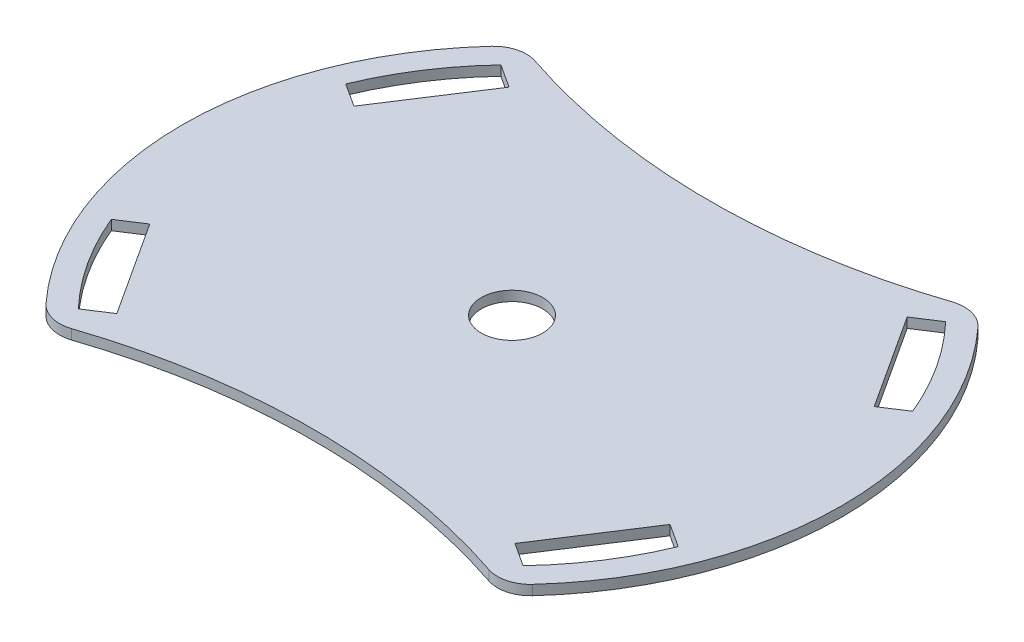
ISO-10303-21;
HEADER;
FILE_DESCRIPTION(('STEP AP214'),'2;1');
FILE_NAME('part.step','',(''),(''),'','','');
FILE_SCHEMA(('AUTOMOTIVE_DESIGN { 1 0 10303 214 1 1 1 1 }'));
ENDSEC;
DATA;
#1=APPLICATION_CONTEXT('core data for automotive mechanical design processes');
#2=APPLICATION_PROTOCOL_DEFINITION('international standard','automotive_design',2000,#1);
#3=PRODUCT_CONTEXT('',#1,'mechanical');
#4=PRODUCT('Part','Part','',(#3));
#5=PRODUCT_RELATED_PRODUCT_CATEGORY('part','',(#4));
#6=PRODUCT_DEFINITION_FORMATION('','',#4);
#7=PRODUCT_DEFINITION_CONTEXT('part definition',#1,'design');
#8=PRODUCT_DEFINITION('design','',#6,#7);
#9=PRODUCT_DEFINITION_SHAPE('','',#8);
#10=(LENGTH_UNIT() NAMED_UNIT(*) SI_UNIT(.MILLI.,.METRE.));
#11=(NAMED_UNIT(*) PLANE_ANGLE_UNIT() SI_UNIT($,.RADIAN.));
#12=(NAMED_UNIT(*) SI_UNIT($,.STERADIAN.) SOLID_ANGLE_UNIT());
#13=UNCERTAINTY_MEASURE_WITH_UNIT(LENGTH_MEASURE(1.E-05),#10,'distance_accuracy_value','');
#14=(GEOMETRIC_REPRESENTATION_CONTEXT(3) GLOBAL_UNCERTAINTY_ASSIGNED_CONTEXT((#13)) GLOBAL_UNIT_ASSIGNED_CONTEXT((#10,
#11,#12)) REPRESENTATION_CONTEXT('',''));
#15=CARTESIAN_POINT('',(0.,0.,0.));
#16=DIRECTION('',(0.,0.,1.));
#17=DIRECTION('',(1.,0.,0.));
#18=AXIS2_PLACEMENT_3D('',#15,#16,#17);
#19=CARTESIAN_POINT('',(-780.443926798838,3.,0.));
#20=DIRECTION('',(0.,1.,0.));
#21=DIRECTION('',(0.,0.,1.));
#22=AXIS2_PLACEMENT_3D('',#19,#20,#21);
#23=PLANE('',#22);
#24=DIRECTION('',(0.544639035015026,0.,-0.838670567945425));
#25=VECTOR('',#24,1.);
#26=CARTESIAN_POINT('',(-69.6096571394702,3.,-45.2050399062472));
#27=LINE('',#26,#25);
#28=CARTESIAN_POINT('',(-78.8685207347256,3.,-30.9476402511751));
#29=VERTEX_POINT('',#28);
#30=CARTESIAN_POINT('',(-60.3507935442147,3.,-59.4624395613195));
#31=VERTEX_POINT('',#30);
#32=EDGE_CURVE('E277',#29,#31,#27,.T.);
#33=ORIENTED_EDGE('',*,*,#32,.F.);
#34=DIRECTION('',(-0.838670567945422,0.,-0.544639035015031));
#35=VECTOR('',#34,1.);
#36=CARTESIAN_POINT('',(-9.25886359525566,3.,14.2573996550724));
#37=LINE('',#36,#35);
#38=CARTESIAN_POINT('',(-85.9410594953263,3.,-35.5406006254929));
#39=VERTEX_POINT('',#38);
#40=EDGE_CURVE('E256',#29,#39,#37,.T.);
#41=ORIENTED_EDGE('',*,*,#40,.T.);
#42=CARTESIAN_POINT('',(0.,3.,0.));
#43=DIRECTION('',(0.,-1.,0.));
#44=DIRECTION('',(0.,0.,1.));
#45=AXIS2_PLACEMENT_3D('',#42,#43,#44);
#46=CIRCLE('',#45,93.);
#47=CARTESIAN_POINT('',(-67.4233323048153,3.,-64.0553999356373));
#48=VERTEX_POINT('',#47);
#49=EDGE_CURVE('E266',#39,#48,#46,.T.);
#50=ORIENTED_EDGE('',*,*,#49,.T.);
#51=DIRECTION('',(-0.838670567945422,0.,-0.54463903501503));
#52=VECTOR('',#51,1.);
#53=CARTESIAN_POINT('',(9.2588635952554,3.,-14.257399655072));
#54=LINE('',#53,#52);
#55=EDGE_CURVE('E280',#31,#48,#54,.T.);
#56=ORIENTED_EDGE('',*,*,#55,.F.);
#57=EDGE_LOOP('',(#33,#41,#50,#56));
#58=FACE_BOUND('',#57,.T.);
#59=DIRECTION('',(0.838670567945422,0.,-0.544639035015031));
#60=VECTOR('',#59,1.);
#61=CARTESIAN_POINT('',(9.25886359525566,3.,14.2573996550724));
#62=LINE('',#61,#60);
#63=CARTESIAN_POINT('',(78.8685207347256,3.,-30.9476402511751));
#64=VERTEX_POINT('',#63);
#65=CARTESIAN_POINT('',(85.9410594953263,3.,-35.5406006254929));
#66=VERTEX_POINT('',#65);
#67=EDGE_CURVE('E288',#64,#66,#62,.T.);
#68=ORIENTED_EDGE('',*,*,#67,.F.);
#69=DIRECTION('',(-0.544639035015026,0.,-0.838670567945425));
#70=VECTOR('',#69,1.);
#71=CARTESIAN_POINT('',(69.6096571394702,3.,-45.2050399062472));
#72=LINE('',#71,#70);
#73=CARTESIAN_POINT('',(60.3507935442147,3.,-59.4624395613195));
#74=VERTEX_POINT('',#73);
#75=EDGE_CURVE('E299',#64,#74,#72,.T.);
#76=ORIENTED_EDGE('',*,*,#75,.T.);
#77=DIRECTION('',(0.838670567945422,0.,-0.54463903501503));
#78=VECTOR('',#77,1.);
#79=CARTESIAN_POINT('',(-9.2588635952554,3.,-14.257399655072));
#80=LINE('',#79,#78);
#81=CARTESIAN_POINT('',(67.4233323048153,3.,-64.0553999356373));
#82=VERTEX_POINT('',#81);
#83=EDGE_CURVE('E312',#74,#82,#80,.T.);
#84=ORIENTED_EDGE('',*,*,#83,.T.);
#85=CARTESIAN_POINT('',(0.,3.,0.));
#86=DIRECTION('',(0.,1.,0.));
#87=DIRECTION('',(0.,0.,1.));
#88=AXIS2_PLACEMENT_3D('',#85,#86,#87);
#89=CIRCLE('',#88,93.);
#90=EDGE_CURVE('E309',#66,#82,#89,.T.);
#91=ORIENTED_EDGE('',*,*,#90,.F.);
#92=EDGE_LOOP('',(#68,#76,#84,#91));
#93=FACE_BOUND('',#92,.T.);
#94=CARTESIAN_POINT('',(0.,3.,0.));
#95=DIRECTION('',(0.,1.,0.));
#96=DIRECTION('',(0.,0.,1.));
#97=AXIS2_PLACEMENT_3D('',#94,#95,#96);
#98=CIRCLE('',#97,9.32734502941397);
#99=CARTESIAN_POINT('',(0.,3.,9.32734502941397));
#100=VERTEX_POINT('',#99);
#101=EDGE_CURVE('E326',#100,#100,#98,.T.);
#102=ORIENTED_EDGE('',*,*,#101,.F.);
#103=EDGE_LOOP('',(#102));
#104=FACE_BOUND('',#103,.T.);
#105=CARTESIAN_POINT('',(0.,3.,-260.));
#106=DIRECTION('',(0.,1.,0.));
#107=DIRECTION('',(0.,0.,1.));
#108=AXIS2_PLACEMENT_3D('',#105,#106,#107);
#109=CIRCLE('',#108,200.);
#110=CARTESIAN_POINT('',(-63.22475900481,3.,-70.2564102564102));
#111=VERTEX_POINT('',#110);
#112=CARTESIAN_POINT('',(63.22475900481,3.,-70.2564102564102));
#113=VERTEX_POINT('',#112);
#114=EDGE_CURVE('E334',#111,#113,#109,.T.);
#115=ORIENTED_EDGE('',*,*,#114,.F.);
#116=CARTESIAN_POINT('',(-66.3859969550505,3.,-60.7692307692308));
#117=DIRECTION('',(0.,1.,0.));
#118=DIRECTION('',(0.,0.,1.));
#119=AXIS2_PLACEMENT_3D('',#116,#117,#118);
#120=CIRCLE('',#119,10.);
#121=CARTESIAN_POINT('',(-73.762218838945,3.,-67.5213675213675));
#122=VERTEX_POINT('',#121);
#123=EDGE_CURVE('E375',#111,#122,#120,.T.);
#124=ORIENTED_EDGE('',*,*,#123,.T.);
#125=CARTESIAN_POINT('',(0.,3.,0.));
#126=DIRECTION('',(0.,1.,0.));
#127=DIRECTION('',(0.,0.,1.));
#128=AXIS2_PLACEMENT_3D('',#125,#126,#127);
#129=CIRCLE('',#128,100.);
#130=CARTESIAN_POINT('',(-73.762218838945,3.,67.5213675213675));
#131=VERTEX_POINT('',#130);
#132=EDGE_CURVE('E329',#122,#131,#129,.T.);
#133=ORIENTED_EDGE('',*,*,#132,.T.);
#134=CARTESIAN_POINT('',(-66.3859969550505,3.,60.7692307692307));
#135=DIRECTION('',(0.,1.,0.));
#136=DIRECTION('',(0.,0.,1.));
#137=AXIS2_PLACEMENT_3D('',#134,#135,#136);
#138=CIRCLE('',#137,10.);
#139=CARTESIAN_POINT('',(-63.22475900481,3.,70.2564102564102));
#140=VERTEX_POINT('',#139);
#141=EDGE_CURVE('E369',#131,#140,#138,.T.);
#142=ORIENTED_EDGE('',*,*,#141,.T.);
#143=CARTESIAN_POINT('',(0.,3.,260.));
#144=DIRECTION('',(0.,1.,0.));
#145=DIRECTION('',(0.,0.,1.));
#146=AXIS2_PLACEMENT_3D('',#143,#144,#145);
#147=CIRCLE('',#146,200.);
#148=CARTESIAN_POINT('',(63.22475900481,3.,70.2564102564102));
#149=VERTEX_POINT('',#148);
#150=EDGE_CURVE('E335',#140,#149,#147,.F.);
#151=ORIENTED_EDGE('',*,*,#150,.T.);
#152=CARTESIAN_POINT('',(66.3859969550505,3.,60.7692307692308));
#153=DIRECTION('',(0.,1.,0.));
#154=DIRECTION('',(0.,0.,1.));
#155=AXIS2_PLACEMENT_3D('',#152,#153,#154);
#156=CIRCLE('',#155,10.);
#157=CARTESIAN_POINT('',(73.762218838945,3.,67.5213675213675));
#158=VERTEX_POINT('',#157);
#159=EDGE_CURVE('E371',#149,#158,#156,.T.);
#160=ORIENTED_EDGE('',*,*,#159,.T.);
#161=CARTESIAN_POINT('',(73.762218838945,3.,-67.5213675213675));
#162=VERTEX_POINT('',#161);
#163=EDGE_CURVE('E331',#158,#162,#129,.T.);
#164=ORIENTED_EDGE('',*,*,#163,.T.);
#165=CARTESIAN_POINT('',(66.3859969550505,3.,-60.7692307692307));
#166=DIRECTION('',(0.,1.,0.));
#167=DIRECTION('',(0.,0.,1.));
#168=AXIS2_PLACEMENT_3D('',#165,#166,#167);
#169=CIRCLE('',#168,10.);
#170=EDGE_CURVE('E373',#162,#113,#169,.T.);
#171=ORIENTED_EDGE('',*,*,#170,.T.);
#172=EDGE_LOOP('',(#115,#124,#133,#142,#151,#160,#164,#171));
#173=FACE_BOUND('',#172,.T.);
#174=DIRECTION('',(-0.838670567945422,0.,0.544639035015031));
#175=VECTOR('',#174,1.);
#176=CARTESIAN_POINT('',(-9.25886359525566,3.,-14.2573996550724));
#177=LINE('',#176,#175);
#178=CARTESIAN_POINT('',(-78.8685207347256,3.,30.9476402511751));
#179=VERTEX_POINT('',#178);
#180=CARTESIAN_POINT('',(-85.9410594953263,3.,35.5406006254929));
#181=VERTEX_POINT('',#180);
#182=EDGE_CURVE('E228',#179,#181,#177,.T.);
#183=ORIENTED_EDGE('',*,*,#182,.F.);
#184=DIRECTION('',(0.544639035015026,0.,0.838670567945425));
#185=VECTOR('',#184,1.);
#186=CARTESIAN_POINT('',(-69.6096571394702,3.,45.2050399062472));
#187=LINE('',#186,#185);
#188=CARTESIAN_POINT('',(-60.3507935442147,3.,59.4624395613195));
#189=VERTEX_POINT('',#188);
#190=EDGE_CURVE('E236',#179,#189,#187,.T.);
#191=ORIENTED_EDGE('',*,*,#190,.T.);
#192=DIRECTION('',(-0.838670567945422,0.,0.54463903501503));
#193=VECTOR('',#192,1.);
#194=CARTESIAN_POINT('',(9.2588635952554,3.,14.257399655072));
#195=LINE('',#194,#193);
#196=CARTESIAN_POINT('',(-67.4233323048153,3.,64.0553999356373));
#197=VERTEX_POINT('',#196);
#198=EDGE_CURVE('E249',#189,#197,#195,.T.);
#199=ORIENTED_EDGE('',*,*,#198,.T.);
#200=CARTESIAN_POINT('',(0.,3.,0.));
#201=DIRECTION('',(0.,1.,0.));
#202=DIRECTION('',(0.,0.,-1.));
#203=AXIS2_PLACEMENT_3D('',#200,#201,#202);
#204=CIRCLE('',#203,93.);
#205=EDGE_CURVE('E246',#181,#197,#204,.T.);
#206=ORIENTED_EDGE('',*,*,#205,.F.);
#207=EDGE_LOOP('',(#183,#191,#199,#206));
#208=FACE_BOUND('',#207,.T.);
#209=DIRECTION('',(-0.544639035015026,0.,0.838670567945425));
#210=VECTOR('',#209,1.);
#211=CARTESIAN_POINT('',(69.6096571394702,3.,45.2050399062472));
#212=LINE('',#211,#210);
#213=CARTESIAN_POINT('',(78.8685207347256,3.,30.9476402511751));
#214=VERTEX_POINT('',#213);
#215=CARTESIAN_POINT('',(60.3507935442147,3.,59.4624395613195));
#216=VERTEX_POINT('',#215);
#217=EDGE_CURVE('E222',#214,#216,#212,.T.);
#218=ORIENTED_EDGE('',*,*,#217,.F.);
#219=DIRECTION('',(0.838670567945422,0.,0.544639035015031));
#220=VECTOR('',#219,1.);
#221=CARTESIAN_POINT('',(9.25886359525566,3.,-14.2573996550724));
#222=LINE('',#221,#220);
#223=CARTESIAN_POINT('',(85.9410594953263,3.,35.5406006254929));
#224=VERTEX_POINT('',#223);
#225=EDGE_CURVE('E50',#214,#224,#222,.T.);
#226=ORIENTED_EDGE('',*,*,#225,.T.);
#227=CARTESIAN_POINT('',(0.,3.,0.));
#228=DIRECTION('',(0.,-1.,0.));
#229=DIRECTION('',(0.,0.,-1.));
#230=AXIS2_PLACEMENT_3D('',#227,#228,#229);
#231=CIRCLE('',#230,93.);
#232=CARTESIAN_POINT('',(67.4233323048153,3.,64.0553999356373));
#233=VERTEX_POINT('',#232);
#234=EDGE_CURVE('E213',#224,#233,#231,.T.);
#235=ORIENTED_EDGE('',*,*,#234,.T.);
#236=DIRECTION('',(0.838670567945422,0.,0.54463903501503));
#237=VECTOR('',#236,1.);
#238=CARTESIAN_POINT('',(-9.2588635952554,3.,14.257399655072));
#239=LINE('',#238,#237);
#240=EDGE_CURVE('E216',#216,#233,#239,.T.);
#241=ORIENTED_EDGE('',*,*,#240,.F.);
#242=EDGE_LOOP('',(#218,#226,#235,#241));
#243=FACE_BOUND('',#242,.T.);
#244=ADVANCED_FACE('F35',(#58,#93,#104,#173,#208,#243),#23,.T.);
#245=CARTESIAN_POINT('',(-780.443926798838,0.,0.));
#246=DIRECTION('',(0.,1.,0.));
#247=DIRECTION('',(0.,0.,1.));
#248=AXIS2_PLACEMENT_3D('',#245,#246,#247);
#249=PLANE('',#248);
#250=DIRECTION('',(-0.838670567945422,0.,-0.544639035015031));
#251=VECTOR('',#250,1.);
#252=CARTESIAN_POINT('',(-9.25886359525566,0.,14.2573996550724));
#253=LINE('',#252,#251);
#254=CARTESIAN_POINT('',(-78.8685207347256,0.,-30.9476402511751));
#255=VERTEX_POINT('',#254);
#256=CARTESIAN_POINT('',(-85.9410594953263,0.,-35.5406006254929));
#257=VERTEX_POINT('',#256);
#258=EDGE_CURVE('E263',#255,#257,#253,.T.);
#259=ORIENTED_EDGE('',*,*,#258,.F.);
#260=DIRECTION('',(0.544639035015026,0.,-0.838670567945425));
#261=VECTOR('',#260,1.);
#262=CARTESIAN_POINT('',(-69.6096571394702,0.,-45.2050399062472));
#263=LINE('',#262,#261);
#264=CARTESIAN_POINT('',(-60.3507935442147,0.,-59.4624395613196));
#265=VERTEX_POINT('',#264);
#266=EDGE_CURVE('E265',#255,#265,#263,.T.);
#267=ORIENTED_EDGE('',*,*,#266,.T.);
#268=DIRECTION('',(-0.838670567945422,0.,-0.54463903501503));
#269=VECTOR('',#268,1.);
#270=CARTESIAN_POINT('',(9.2588635952554,0.,-14.257399655072));
#271=LINE('',#270,#269);
#272=CARTESIAN_POINT('',(-67.4233323048153,0.,-64.0553999356373));
#273=VERTEX_POINT('',#272);
#274=EDGE_CURVE('E269',#265,#273,#271,.T.);
#275=ORIENTED_EDGE('',*,*,#274,.T.);
#276=CARTESIAN_POINT('',(0.,0.,0.));
#277=DIRECTION('',(0.,-1.,0.));
#278=DIRECTION('',(0.,0.,1.));
#279=AXIS2_PLACEMENT_3D('',#276,#277,#278);
#280=CIRCLE('',#279,93.);
#281=EDGE_CURVE('E272',#257,#273,#280,.T.);
#282=ORIENTED_EDGE('',*,*,#281,.F.);
#283=EDGE_LOOP('',(#259,#267,#275,#282));
#284=FACE_BOUND('',#283,.T.);
#285=DIRECTION('',(-0.544639035015026,0.,-0.838670567945425));
#286=VECTOR('',#285,1.);
#287=CARTESIAN_POINT('',(69.6096571394702,0.,-45.2050399062472));
#288=LINE('',#287,#286);
#289=CARTESIAN_POINT('',(78.8685207347256,0.,-30.9476402511751));
#290=VERTEX_POINT('',#289);
#291=CARTESIAN_POINT('',(60.3507935442147,0.,-59.4624395613195));
#292=VERTEX_POINT('',#291);
#293=EDGE_CURVE('E305',#290,#292,#288,.T.);
#294=ORIENTED_EDGE('',*,*,#293,.F.);
#295=DIRECTION('',(0.838670567945422,0.,-0.544639035015031));
#296=VECTOR('',#295,1.);
#297=CARTESIAN_POINT('',(9.25886359525566,0.,14.2573996550724));
#298=LINE('',#297,#296);
#299=CARTESIAN_POINT('',(85.9410594953263,0.,-35.5406006254929));
#300=VERTEX_POINT('',#299);
#301=EDGE_CURVE('E295',#290,#300,#298,.T.);
#302=ORIENTED_EDGE('',*,*,#301,.T.);
#303=CARTESIAN_POINT('',(0.,0.,0.));
#304=DIRECTION('',(0.,1.,0.));
#305=DIRECTION('',(0.,0.,1.));
#306=AXIS2_PLACEMENT_3D('',#303,#304,#305);
#307=CIRCLE('',#306,93.);
#308=CARTESIAN_POINT('',(67.4233323048153,0.,-64.0553999356373));
#309=VERTEX_POINT('',#308);
#310=EDGE_CURVE('E298',#300,#309,#307,.T.);
#311=ORIENTED_EDGE('',*,*,#310,.T.);
#312=DIRECTION('',(0.838670567945422,0.,-0.54463903501503));
#313=VECTOR('',#312,1.);
#314=CARTESIAN_POINT('',(-9.2588635952554,0.,-14.257399655072));
#315=LINE('',#314,#313);
#316=EDGE_CURVE('E302',#292,#309,#315,.T.);
#317=ORIENTED_EDGE('',*,*,#316,.F.);
#318=EDGE_LOOP('',(#294,#302,#311,#317));
#319=FACE_BOUND('',#318,.T.);
#320=CARTESIAN_POINT('',(0.,0.,0.));
#321=DIRECTION('',(0.,1.,0.));
#322=DIRECTION('',(0.,0.,1.));
#323=AXIS2_PLACEMENT_3D('',#320,#321,#322);
#324=CIRCLE('',#323,9.32734502941397);
#325=CARTESIAN_POINT('',(0.,0.,9.32734502941397));
#326=VERTEX_POINT('',#325);
#327=EDGE_CURVE('E319',#326,#326,#324,.T.);
#328=ORIENTED_EDGE('',*,*,#327,.T.);
#329=EDGE_LOOP('',(#328));
#330=FACE_BOUND('',#329,.T.);
#331=CARTESIAN_POINT('',(0.,0.,0.));
#332=DIRECTION('',(0.,1.,0.));
#333=DIRECTION('',(0.,0.,1.));
#334=AXIS2_PLACEMENT_3D('',#331,#332,#333);
#335=CIRCLE('',#334,100.);
#336=CARTESIAN_POINT('',(-73.762218838945,0.,-67.5213675213675));
#337=VERTEX_POINT('',#336);
#338=CARTESIAN_POINT('',(-73.762218838945,0.,67.5213675213675));
#339=VERTEX_POINT('',#338);
#340=EDGE_CURVE('E343',#337,#339,#335,.T.);
#341=ORIENTED_EDGE('',*,*,#340,.F.);
#342=CARTESIAN_POINT('',(-66.3859969550505,0.,-60.7692307692308));
#343=DIRECTION('',(0.,1.,0.));
#344=DIRECTION('',(0.,0.,1.));
#345=AXIS2_PLACEMENT_3D('',#342,#343,#344);
#346=CIRCLE('',#345,10.);
#347=CARTESIAN_POINT('',(-63.22475900481,0.,-70.2564102564102));
#348=VERTEX_POINT('',#347);
#349=EDGE_CURVE('E362',#337,#348,#346,.F.);
#350=ORIENTED_EDGE('',*,*,#349,.T.);
#351=CARTESIAN_POINT('',(0.,0.,-260.));
#352=DIRECTION('',(0.,1.,0.));
#353=DIRECTION('',(0.,0.,1.));
#354=AXIS2_PLACEMENT_3D('',#351,#352,#353);
#355=CIRCLE('',#354,200.);
#356=CARTESIAN_POINT('',(63.22475900481,0.,-70.2564102564102));
#357=VERTEX_POINT('',#356);
#358=EDGE_CURVE('E330',#348,#357,#355,.T.);
#359=ORIENTED_EDGE('',*,*,#358,.T.);
#360=CARTESIAN_POINT('',(66.3859969550505,0.,-60.7692307692307));
#361=DIRECTION('',(0.,1.,0.));
#362=DIRECTION('',(0.,0.,1.));
#363=AXIS2_PLACEMENT_3D('',#360,#361,#362);
#364=CIRCLE('',#363,10.);
#365=CARTESIAN_POINT('',(73.762218838945,0.,-67.5213675213675));
#366=VERTEX_POINT('',#365);
#367=EDGE_CURVE('E360',#357,#366,#364,.F.);
#368=ORIENTED_EDGE('',*,*,#367,.T.);
#369=CARTESIAN_POINT('',(73.762218838945,0.,67.5213675213675));
#370=VERTEX_POINT('',#369);
#371=EDGE_CURVE('E344',#370,#366,#335,.T.);
#372=ORIENTED_EDGE('',*,*,#371,.F.);
#373=CARTESIAN_POINT('',(66.3859969550505,0.,60.7692307692308));
#374=DIRECTION('',(0.,1.,0.));
#375=DIRECTION('',(0.,0.,1.));
#376=AXIS2_PLACEMENT_3D('',#373,#374,#375);
#377=CIRCLE('',#376,10.);
#378=CARTESIAN_POINT('',(63.22475900481,0.,70.2564102564102));
#379=VERTEX_POINT('',#378);
#380=EDGE_CURVE('E358',#370,#379,#377,.F.);
#381=ORIENTED_EDGE('',*,*,#380,.T.);
#382=CARTESIAN_POINT('',(0.,0.,260.));
#383=DIRECTION('',(0.,1.,0.));
#384=DIRECTION('',(0.,0.,1.));
#385=AXIS2_PLACEMENT_3D('',#382,#383,#384);
#386=CIRCLE('',#385,200.);
#387=CARTESIAN_POINT('',(-63.22475900481,0.,70.2564102564102));
#388=VERTEX_POINT('',#387);
#389=EDGE_CURVE('E347',#388,#379,#386,.F.);
#390=ORIENTED_EDGE('',*,*,#389,.F.);
#391=CARTESIAN_POINT('',(-66.3859969550505,0.,60.7692307692307));
#392=DIRECTION('',(0.,1.,0.));
#393=DIRECTION('',(0.,0.,1.));
#394=AXIS2_PLACEMENT_3D('',#391,#392,#393);
#395=CIRCLE('',#394,10.);
#396=EDGE_CURVE('E356',#388,#339,#395,.F.);
#397=ORIENTED_EDGE('',*,*,#396,.T.);
#398=EDGE_LOOP('',(#341,#350,#359,#368,#372,#381,#390,#397));
#399=FACE_BOUND('',#398,.T.);
#400=DIRECTION('',(0.544639035015026,0.,0.838670567945425));
#401=VECTOR('',#400,1.);
#402=CARTESIAN_POINT('',(-69.6096571394702,0.,45.2050399062472));
#403=LINE('',#402,#401);
#404=CARTESIAN_POINT('',(-78.8685207347256,0.,30.9476402511751));
#405=VERTEX_POINT('',#404);
#406=CARTESIAN_POINT('',(-60.3507935442147,0.,59.4624395613195));
#407=VERTEX_POINT('',#406);
#408=EDGE_CURVE('E242',#405,#407,#403,.T.);
#409=ORIENTED_EDGE('',*,*,#408,.F.);
#410=DIRECTION('',(-0.838670567945422,0.,0.544639035015031));
#411=VECTOR('',#410,1.);
#412=CARTESIAN_POINT('',(-9.25886359525566,0.,-14.2573996550724));
#413=LINE('',#412,#411);
#414=CARTESIAN_POINT('',(-85.9410594953263,0.,35.5406006254929));
#415=VERTEX_POINT('',#414);
#416=EDGE_CURVE('E232',#405,#415,#413,.T.);
#417=ORIENTED_EDGE('',*,*,#416,.T.);
#418=CARTESIAN_POINT('',(0.,0.,0.));
#419=DIRECTION('',(0.,1.,0.));
#420=DIRECTION('',(0.,0.,-1.));
#421=AXIS2_PLACEMENT_3D('',#418,#419,#420);
#422=CIRCLE('',#421,93.);
#423=CARTESIAN_POINT('',(-67.4233323048153,0.,64.0553999356373));
#424=VERTEX_POINT('',#423);
#425=EDGE_CURVE('E235',#415,#424,#422,.T.);
#426=ORIENTED_EDGE('',*,*,#425,.T.);
#427=DIRECTION('',(-0.838670567945422,0.,0.54463903501503));
#428=VECTOR('',#427,1.);
#429=CARTESIAN_POINT('',(9.2588635952554,0.,14.257399655072));
#430=LINE('',#429,#428);
#431=EDGE_CURVE('E239',#407,#424,#430,.T.);
#432=ORIENTED_EDGE('',*,*,#431,.F.);
#433=EDGE_LOOP('',(#409,#417,#426,#432));
#434=FACE_BOUND('',#433,.T.);
#435=DIRECTION('',(0.838670567945422,0.,0.544639035015031));
#436=VECTOR('',#435,1.);
#437=CARTESIAN_POINT('',(9.25886359525566,0.,-14.2573996550724));
#438=LINE('',#437,#436);
#439=CARTESIAN_POINT('',(78.8685207347256,0.,30.9476402511751));
#440=VERTEX_POINT('',#439);
#441=CARTESIAN_POINT('',(85.9410594953263,0.,35.5406006254929));
#442=VERTEX_POINT('',#441);
#443=EDGE_CURVE('E198',#440,#442,#438,.T.);
#444=ORIENTED_EDGE('',*,*,#443,.F.);
#445=DIRECTION('',(-0.544639035015026,0.,0.838670567945425));
#446=VECTOR('',#445,1.);
#447=CARTESIAN_POINT('',(69.6096571394702,0.,45.2050399062472));
#448=LINE('',#447,#446);
#449=CARTESIAN_POINT('',(60.3507935442147,0.,59.4624395613196));
#450=VERTEX_POINT('',#449);
#451=EDGE_CURVE('E207',#440,#450,#448,.T.);
#452=ORIENTED_EDGE('',*,*,#451,.T.);
#453=DIRECTION('',(0.838670567945422,0.,0.54463903501503));
#454=VECTOR('',#453,1.);
#455=CARTESIAN_POINT('',(-9.2588635952554,0.,14.257399655072));
#456=LINE('',#455,#454);
#457=CARTESIAN_POINT('',(67.4233323048153,0.,64.0553999356373));
#458=VERTEX_POINT('',#457);
#459=EDGE_CURVE('E58',#450,#458,#456,.T.);
#460=ORIENTED_EDGE('',*,*,#459,.T.);
#461=CARTESIAN_POINT('',(0.,0.,0.));
#462=DIRECTION('',(0.,-1.,0.));
#463=DIRECTION('',(0.,0.,-1.));
#464=AXIS2_PLACEMENT_3D('',#461,#462,#463);
#465=CIRCLE('',#464,93.);
#466=EDGE_CURVE('E204',#442,#458,#465,.T.);
#467=ORIENTED_EDGE('',*,*,#466,.F.);
#468=EDGE_LOOP('',(#444,#452,#460,#467));
#469=FACE_BOUND('',#468,.T.);
#470=ADVANCED_FACE('F212',(#284,#319,#330,#399,#434,#469),#249,.F.);
#471=CARTESIAN_POINT('',(0.,3.,0.));
#472=DIRECTION('',(0.,-1.,0.));
#473=DIRECTION('',(0.,0.,-1.));
#474=AXIS2_PLACEMENT_3D('',#471,#472,#473);
#475=CYLINDRICAL_SURFACE('',#474,100.);
#476=ORIENTED_EDGE('',*,*,#132,.F.);
#477=DIRECTION('',(0.,-1.,0.));
#478=VECTOR('',#477,1.);
#479=CARTESIAN_POINT('',(-73.762218838945,3.,-67.5213675213675));
#480=LINE('',#479,#478);
#481=EDGE_CURVE('E353',#122,#337,#480,.T.);
#482=ORIENTED_EDGE('',*,*,#481,.T.);
#483=ORIENTED_EDGE('',*,*,#340,.T.);
#484=DIRECTION('',(0.,-1.,0.));
#485=VECTOR('',#484,1.);
#486=CARTESIAN_POINT('',(-73.762218838945,3.,67.5213675213675));
#487=LINE('',#486,#485);
#488=EDGE_CURVE('E340',#339,#131,#487,.F.);
#489=ORIENTED_EDGE('',*,*,#488,.T.);
#490=EDGE_LOOP('',(#476,#482,#483,#489));
#491=FACE_BOUND('',#490,.T.);
#492=ADVANCED_FACE('F420',(#491),#475,.T.);
#493=CARTESIAN_POINT('',(0.,3.,260.));
#494=DIRECTION('',(0.,-1.,0.));
#495=DIRECTION('',(0.,0.,-1.));
#496=AXIS2_PLACEMENT_3D('',#493,#494,#495);
#497=CYLINDRICAL_SURFACE('',#496,200.);
#498=ORIENTED_EDGE('',*,*,#389,.T.);
#499=DIRECTION('',(0.,-1.,0.));
#500=VECTOR('',#499,1.);
#501=CARTESIAN_POINT('',(63.22475900481,3.,70.2564102564102));
#502=LINE('',#501,#500);
#503=EDGE_CURVE('E11',#379,#149,#502,.F.);
#504=ORIENTED_EDGE('',*,*,#503,.T.);
#505=ORIENTED_EDGE('',*,*,#150,.F.);
#506=DIRECTION('',(0.,-1.,0.));
#507=VECTOR('',#506,1.);
#508=CARTESIAN_POINT('',(-63.22475900481,3.,70.2564102564102));
#509=LINE('',#508,#507);
#510=EDGE_CURVE('E43',#140,#388,#509,.T.);
#511=ORIENTED_EDGE('',*,*,#510,.T.);
#512=EDGE_LOOP('',(#498,#504,#505,#511));
#513=FACE_BOUND('',#512,.T.);
#514=ADVANCED_FACE('F386',(#513),#497,.F.);
#515=ORIENTED_EDGE('',*,*,#371,.T.);
#516=DIRECTION('',(0.,-1.,0.));
#517=VECTOR('',#516,1.);
#518=CARTESIAN_POINT('',(73.762218838945,3.,-67.5213675213675));
#519=LINE('',#518,#517);
#520=EDGE_CURVE('E380',#366,#162,#519,.F.);
#521=ORIENTED_EDGE('',*,*,#520,.T.);
#522=ORIENTED_EDGE('',*,*,#163,.F.);
#523=DIRECTION('',(0.,-1.,0.));
#524=VECTOR('',#523,1.);
#525=CARTESIAN_POINT('',(73.762218838945,3.,67.5213675213675));
#526=LINE('',#525,#524);
#527=EDGE_CURVE('E377',#158,#370,#526,.T.);
#528=ORIENTED_EDGE('',*,*,#527,.T.);
#529=EDGE_LOOP('',(#515,#521,#522,#528));
#530=FACE_BOUND('',#529,.T.);
#531=ADVANCED_FACE('F401',(#530),#475,.T.);
#532=CARTESIAN_POINT('',(0.,3.,0.));
#533=DIRECTION('',(0.,-1.,0.));
#534=DIRECTION('',(0.,0.,-1.));
#535=AXIS2_PLACEMENT_3D('',#532,#533,#534);
#536=CYLINDRICAL_SURFACE('',#535,9.32734502941397);
#537=ORIENTED_EDGE('',*,*,#101,.T.);
#538=EDGE_LOOP('',(#537));
#539=FACE_BOUND('',#538,.T.);
#540=ORIENTED_EDGE('',*,*,#327,.F.);
#541=EDGE_LOOP('',(#540));
#542=FACE_BOUND('',#541,.T.);
#543=ADVANCED_FACE('F450',(#539,#542),#536,.F.);
#544=CARTESIAN_POINT('',(0.,3.,-260.));
#545=DIRECTION('',(0.,-1.,0.));
#546=DIRECTION('',(0.,0.,-1.));
#547=AXIS2_PLACEMENT_3D('',#544,#545,#546);
#548=CYLINDRICAL_SURFACE('',#547,200.);
#549=ORIENTED_EDGE('',*,*,#358,.F.);
#550=DIRECTION('',(0.,-1.,0.));
#551=VECTOR('',#550,1.);
#552=CARTESIAN_POINT('',(-63.22475900481,3.,-70.2564102564102));
#553=LINE('',#552,#551);
#554=EDGE_CURVE('E367',#348,#111,#553,.F.);
#555=ORIENTED_EDGE('',*,*,#554,.T.);
#556=ORIENTED_EDGE('',*,*,#114,.T.);
#557=DIRECTION('',(0.,-1.,0.));
#558=VECTOR('',#557,1.);
#559=CARTESIAN_POINT('',(63.22475900481,3.,-70.2564102564102));
#560=LINE('',#559,#558);
#561=EDGE_CURVE('E364',#113,#357,#560,.T.);
#562=ORIENTED_EDGE('',*,*,#561,.T.);
#563=EDGE_LOOP('',(#549,#555,#556,#562));
#564=FACE_BOUND('',#563,.T.);
#565=ADVANCED_FACE('F412',(#564),#548,.F.);
#566=CARTESIAN_POINT('',(9.25886359525566,0.,14.2573996550724));
#567=DIRECTION('',(0.544639035015031,0.,0.838670567945422));
#568=DIRECTION('',(0.838670567945422,0.,-0.544639035015031));
#569=AXIS2_PLACEMENT_3D('',#566,#567,#568);
#570=PLANE('',#569);
#571=ORIENTED_EDGE('',*,*,#67,.T.);
#572=DIRECTION('',(0.,1.,0.));
#573=VECTOR('',#572,1.);
#574=CARTESIAN_POINT('',(85.9410594953263,0.,-35.5406006254929));
#575=LINE('',#574,#573);
#576=EDGE_CURVE('E307',#300,#66,#575,.T.);
#577=ORIENTED_EDGE('',*,*,#576,.F.);
#578=ORIENTED_EDGE('',*,*,#301,.F.);
#579=DIRECTION('',(0.,1.,0.));
#580=VECTOR('',#579,1.);
#581=CARTESIAN_POINT('',(78.8685207347256,0.,-30.9476402511751));
#582=LINE('',#581,#580);
#583=EDGE_CURVE('E317',#290,#64,#582,.T.);
#584=ORIENTED_EDGE('',*,*,#583,.T.);
#585=EDGE_LOOP('',(#571,#577,#578,#584));
#586=FACE_BOUND('',#585,.T.);
#587=ADVANCED_FACE('F445',(#586),#570,.F.);
#588=CARTESIAN_POINT('',(69.6096571394702,0.,-45.2050399062472));
#589=DIRECTION('',(0.838670567945424,0.,-0.544639035015026));
#590=DIRECTION('',(-0.544639035015026,0.,-0.838670567945425));
#591=AXIS2_PLACEMENT_3D('',#588,#589,#590);
#592=PLANE('',#591);
#593=ORIENTED_EDGE('',*,*,#75,.F.);
#594=ORIENTED_EDGE('',*,*,#583,.F.);
#595=ORIENTED_EDGE('',*,*,#293,.T.);
#596=DIRECTION('',(0.,1.,0.));
#597=VECTOR('',#596,1.);
#598=CARTESIAN_POINT('',(60.3507935442147,0.,-59.4624395613195));
#599=LINE('',#598,#597);
#600=EDGE_CURVE('E320',#292,#74,#599,.T.);
#601=ORIENTED_EDGE('',*,*,#600,.T.);
#602=EDGE_LOOP('',(#593,#594,#595,#601));
#603=FACE_BOUND('',#602,.T.);
#604=ADVANCED_FACE('F598',(#603),#592,.T.);
#605=CARTESIAN_POINT('',(-9.2588635952554,0.,-14.257399655072));
#606=DIRECTION('',(0.54463903501503,0.,0.838670567945422));
#607=DIRECTION('',(0.838670567945422,0.,-0.54463903501503));
#608=AXIS2_PLACEMENT_3D('',#605,#606,#607);
#609=PLANE('',#608);
#610=ORIENTED_EDGE('',*,*,#83,.F.);
#611=ORIENTED_EDGE('',*,*,#600,.F.);
#612=ORIENTED_EDGE('',*,*,#316,.T.);
#613=DIRECTION('',(0.,1.,0.));
#614=VECTOR('',#613,1.);
#615=CARTESIAN_POINT('',(67.4233323048153,0.,-64.0553999356373));
#616=LINE('',#615,#614);
#617=EDGE_CURVE('E322',#309,#82,#616,.T.);
#618=ORIENTED_EDGE('',*,*,#617,.T.);
#619=EDGE_LOOP('',(#610,#611,#612,#618));
#620=FACE_BOUND('',#619,.T.);
#621=ADVANCED_FACE('F601',(#620),#609,.T.);
#622=CARTESIAN_POINT('',(0.,0.,0.));
#623=DIRECTION('',(0.,1.,0.));
#624=DIRECTION('',(0.,0.,1.));
#625=AXIS2_PLACEMENT_3D('',#622,#623,#624);
#626=CYLINDRICAL_SURFACE('',#625,93.);
#627=ORIENTED_EDGE('',*,*,#90,.T.);
#628=ORIENTED_EDGE('',*,*,#617,.F.);
#629=ORIENTED_EDGE('',*,*,#310,.F.);
#630=ORIENTED_EDGE('',*,*,#576,.T.);
#631=EDGE_LOOP('',(#627,#628,#629,#630));
#632=FACE_BOUND('',#631,.T.);
#633=ADVANCED_FACE('F460',(#632),#626,.F.);
#634=CARTESIAN_POINT('',(-66.3859969550505,3.,-60.7692307692308));
#635=DIRECTION('',(0.,1.,0.));
#636=DIRECTION('',(0.,0.,1.));
#637=AXIS2_PLACEMENT_3D('',#634,#635,#636);
#638=CYLINDRICAL_SURFACE('',#637,10.);
#639=ORIENTED_EDGE('',*,*,#123,.F.);
#640=ORIENTED_EDGE('',*,*,#554,.F.);
#641=ORIENTED_EDGE('',*,*,#349,.F.);
#642=ORIENTED_EDGE('',*,*,#481,.F.);
#643=EDGE_LOOP('',(#639,#640,#641,#642));
#644=FACE_BOUND('',#643,.T.);
#645=ADVANCED_FACE('F417',(#644),#638,.T.);
#646=CARTESIAN_POINT('',(66.3859969550505,3.,-60.7692307692307));
#647=DIRECTION('',(0.,1.,0.));
#648=DIRECTION('',(0.,0.,1.));
#649=AXIS2_PLACEMENT_3D('',#646,#647,#648);
#650=CYLINDRICAL_SURFACE('',#649,10.);
#651=ORIENTED_EDGE('',*,*,#170,.F.);
#652=ORIENTED_EDGE('',*,*,#520,.F.);
#653=ORIENTED_EDGE('',*,*,#367,.F.);
#654=ORIENTED_EDGE('',*,*,#561,.F.);
#655=EDGE_LOOP('',(#651,#652,#653,#654));
#656=FACE_BOUND('',#655,.T.);
#657=ADVANCED_FACE('F409',(#656),#650,.T.);
#658=CARTESIAN_POINT('',(66.3859969550505,3.,60.7692307692308));
#659=DIRECTION('',(0.,1.,0.));
#660=DIRECTION('',(0.,0.,1.));
#661=AXIS2_PLACEMENT_3D('',#658,#659,#660);
#662=CYLINDRICAL_SURFACE('',#661,10.);
#663=ORIENTED_EDGE('',*,*,#159,.F.);
#664=ORIENTED_EDGE('',*,*,#503,.F.);
#665=ORIENTED_EDGE('',*,*,#380,.F.);
#666=ORIENTED_EDGE('',*,*,#527,.F.);
#667=EDGE_LOOP('',(#663,#664,#665,#666));
#668=FACE_BOUND('',#667,.T.);
#669=ADVANCED_FACE('F398',(#668),#662,.T.);
#670=CARTESIAN_POINT('',(-66.3859969550505,3.,60.7692307692307));
#671=DIRECTION('',(0.,1.,0.));
#672=DIRECTION('',(0.,0.,1.));
#673=AXIS2_PLACEMENT_3D('',#670,#671,#672);
#674=CYLINDRICAL_SURFACE('',#673,10.);
#675=ORIENTED_EDGE('',*,*,#141,.F.);
#676=ORIENTED_EDGE('',*,*,#488,.F.);
#677=ORIENTED_EDGE('',*,*,#396,.F.);
#678=ORIENTED_EDGE('',*,*,#510,.F.);
#679=EDGE_LOOP('',(#675,#676,#677,#678));
#680=FACE_BOUND('',#679,.T.);
#681=ADVANCED_FACE('F37',(#680),#674,.T.);
#682=CARTESIAN_POINT('',(-9.25886359525566,0.,14.2573996550724));
#683=DIRECTION('',(0.544639035015031,0.,-0.838670567945422));
#684=DIRECTION('',(-0.838670567945422,0.,-0.544639035015031));
#685=AXIS2_PLACEMENT_3D('',#682,#683,#684);
#686=PLANE('',#685);
#687=ORIENTED_EDGE('',*,*,#40,.F.);
#688=DIRECTION('',(0.,1.,0.));
#689=VECTOR('',#688,1.);
#690=CARTESIAN_POINT('',(-78.8685207347256,0.,-30.9476402511751));
#691=LINE('',#690,#689);
#692=EDGE_CURVE('E274',#255,#29,#691,.T.);
#693=ORIENTED_EDGE('',*,*,#692,.F.);
#694=ORIENTED_EDGE('',*,*,#258,.T.);
#695=DIRECTION('',(0.,1.,0.));
#696=VECTOR('',#695,1.);
#697=CARTESIAN_POINT('',(-85.9410594953263,0.,-35.5406006254929));
#698=LINE('',#697,#696);
#699=EDGE_CURVE('E285',#257,#39,#698,.T.);
#700=ORIENTED_EDGE('',*,*,#699,.T.);
#701=EDGE_LOOP('',(#687,#693,#694,#700));
#702=FACE_BOUND('',#701,.T.);
#703=ADVANCED_FACE('F424',(#702),#686,.T.);
#704=CARTESIAN_POINT('',(0.,0.,0.));
#705=DIRECTION('',(0.,1.,0.));
#706=DIRECTION('',(0.,0.,1.));
#707=AXIS2_PLACEMENT_3D('',#704,#705,#706);
#708=CYLINDRICAL_SURFACE('',#707,93.);
#709=ORIENTED_EDGE('',*,*,#49,.F.);
#710=ORIENTED_EDGE('',*,*,#699,.F.);
#711=ORIENTED_EDGE('',*,*,#281,.T.);
#712=DIRECTION('',(0.,1.,0.));
#713=VECTOR('',#712,1.);
#714=CARTESIAN_POINT('',(-67.4233323048153,0.,-64.0553999356373));
#715=LINE('',#714,#713);
#716=EDGE_CURVE('E289',#273,#48,#715,.T.);
#717=ORIENTED_EDGE('',*,*,#716,.T.);
#718=EDGE_LOOP('',(#709,#710,#711,#717));
#719=FACE_BOUND('',#718,.T.);
#720=ADVANCED_FACE('F430',(#719),#708,.F.);
#721=CARTESIAN_POINT('',(9.2588635952554,0.,-14.257399655072));
#722=DIRECTION('',(0.54463903501503,0.,-0.838670567945422));
#723=DIRECTION('',(-0.838670567945422,0.,-0.54463903501503));
#724=AXIS2_PLACEMENT_3D('',#721,#722,#723);
#725=PLANE('',#724);
#726=ORIENTED_EDGE('',*,*,#55,.T.);
#727=ORIENTED_EDGE('',*,*,#716,.F.);
#728=ORIENTED_EDGE('',*,*,#274,.F.);
#729=DIRECTION('',(0.,1.,0.));
#730=VECTOR('',#729,1.);
#731=CARTESIAN_POINT('',(-60.3507935442147,0.,-59.4624395613195));
#732=LINE('',#731,#730);
#733=EDGE_CURVE('E291',#265,#31,#732,.T.);
#734=ORIENTED_EDGE('',*,*,#733,.T.);
#735=EDGE_LOOP('',(#726,#727,#728,#734));
#736=FACE_BOUND('',#735,.T.);
#737=ADVANCED_FACE('F490',(#736),#725,.F.);
#738=CARTESIAN_POINT('',(-69.6096571394702,0.,-45.2050399062472));
#739=DIRECTION('',(0.838670567945424,0.,0.544639035015026));
#740=DIRECTION('',(0.544639035015026,0.,-0.838670567945425));
#741=AXIS2_PLACEMENT_3D('',#738,#739,#740);
#742=PLANE('',#741);
#743=ORIENTED_EDGE('',*,*,#32,.T.);
#744=ORIENTED_EDGE('',*,*,#733,.F.);
#745=ORIENTED_EDGE('',*,*,#266,.F.);
#746=ORIENTED_EDGE('',*,*,#692,.T.);
#747=EDGE_LOOP('',(#743,#744,#745,#746));
#748=FACE_BOUND('',#747,.T.);
#749=ADVANCED_FACE('F499',(#748),#742,.F.);
#750=CARTESIAN_POINT('',(-9.25886359525566,0.,-14.2573996550724));
#751=DIRECTION('',(-0.544639035015031,0.,-0.838670567945422));
#752=DIRECTION('',(-0.838670567945422,0.,0.544639035015031));
#753=AXIS2_PLACEMENT_3D('',#750,#751,#752);
#754=PLANE('',#753);
#755=ORIENTED_EDGE('',*,*,#182,.T.);
#756=DIRECTION('',(0.,1.,0.));
#757=VECTOR('',#756,1.);
#758=CARTESIAN_POINT('',(-85.9410594953263,0.,35.5406006254929));
#759=LINE('',#758,#757);
#760=EDGE_CURVE('E244',#415,#181,#759,.T.);
#761=ORIENTED_EDGE('',*,*,#760,.F.);
#762=ORIENTED_EDGE('',*,*,#416,.F.);
#763=DIRECTION('',(0.,1.,0.));
#764=VECTOR('',#763,1.);
#765=CARTESIAN_POINT('',(-78.8685207347256,0.,30.9476402511751));
#766=LINE('',#765,#764);
#767=EDGE_CURVE('E254',#405,#179,#766,.T.);
#768=ORIENTED_EDGE('',*,*,#767,.T.);
#769=EDGE_LOOP('',(#755,#761,#762,#768));
#770=FACE_BOUND('',#769,.T.);
#771=ADVANCED_FACE('F508',(#770),#754,.F.);
#772=CARTESIAN_POINT('',(-69.6096571394702,0.,45.2050399062472));
#773=DIRECTION('',(-0.838670567945424,0.,0.544639035015026));
#774=DIRECTION('',(0.544639035015026,0.,0.838670567945425));
#775=AXIS2_PLACEMENT_3D('',#772,#773,#774);
#776=PLANE('',#775);
#777=ORIENTED_EDGE('',*,*,#190,.F.);
#778=ORIENTED_EDGE('',*,*,#767,.F.);
#779=ORIENTED_EDGE('',*,*,#408,.T.);
#780=DIRECTION('',(0.,1.,0.));
#781=VECTOR('',#780,1.);
#782=CARTESIAN_POINT('',(-60.3507935442147,0.,59.4624395613195));
#783=LINE('',#782,#781);
#784=EDGE_CURVE('E257',#407,#189,#783,.T.);
#785=ORIENTED_EDGE('',*,*,#784,.T.);
#786=EDGE_LOOP('',(#777,#778,#779,#785));
#787=FACE_BOUND('',#786,.T.);
#788=ADVANCED_FACE('F519',(#787),#776,.T.);
#789=CARTESIAN_POINT('',(9.2588635952554,0.,14.257399655072));
#790=DIRECTION('',(-0.54463903501503,0.,-0.838670567945422));
#791=DIRECTION('',(-0.838670567945422,0.,0.54463903501503));
#792=AXIS2_PLACEMENT_3D('',#789,#790,#791);
#793=PLANE('',#792);
#794=ORIENTED_EDGE('',*,*,#198,.F.);
#795=ORIENTED_EDGE('',*,*,#784,.F.);
#796=ORIENTED_EDGE('',*,*,#431,.T.);
#797=DIRECTION('',(0.,1.,0.));
#798=VECTOR('',#797,1.);
#799=CARTESIAN_POINT('',(-67.4233323048153,0.,64.0553999356373));
#800=LINE('',#799,#798);
#801=EDGE_CURVE('E259',#424,#197,#800,.T.);
#802=ORIENTED_EDGE('',*,*,#801,.T.);
#803=EDGE_LOOP('',(#794,#795,#796,#802));
#804=FACE_BOUND('',#803,.T.);
#805=ADVANCED_FACE('F527',(#804),#793,.T.);
#806=CARTESIAN_POINT('',(0.,0.,0.));
#807=DIRECTION('',(0.,1.,0.));
#808=DIRECTION('',(0.,0.,1.));
#809=AXIS2_PLACEMENT_3D('',#806,#807,#808);
#810=CYLINDRICAL_SURFACE('',#809,93.);
#811=ORIENTED_EDGE('',*,*,#205,.T.);
#812=ORIENTED_EDGE('',*,*,#801,.F.);
#813=ORIENTED_EDGE('',*,*,#425,.F.);
#814=ORIENTED_EDGE('',*,*,#760,.T.);
#815=EDGE_LOOP('',(#811,#812,#813,#814));
#816=FACE_BOUND('',#815,.T.);
#817=ADVANCED_FACE('F535',(#816),#810,.F.);
#818=CARTESIAN_POINT('',(9.25886359525566,0.,-14.2573996550724));
#819=DIRECTION('',(-0.544639035015031,0.,0.838670567945422));
#820=DIRECTION('',(0.838670567945422,0.,0.544639035015031));
#821=AXIS2_PLACEMENT_3D('',#818,#819,#820);
#822=PLANE('',#821);
#823=ORIENTED_EDGE('',*,*,#225,.F.);
#824=DIRECTION('',(0.,1.,0.));
#825=VECTOR('',#824,1.);
#826=CARTESIAN_POINT('',(78.8685207347256,0.,30.9476402511751));
#827=LINE('',#826,#825);
#828=EDGE_CURVE('E194',#440,#214,#827,.T.);
#829=ORIENTED_EDGE('',*,*,#828,.F.);
#830=ORIENTED_EDGE('',*,*,#443,.T.);
#831=DIRECTION('',(0.,1.,0.));
#832=VECTOR('',#831,1.);
#833=CARTESIAN_POINT('',(85.9410594953263,0.,35.5406006254929));
#834=LINE('',#833,#832);
#835=EDGE_CURVE('E226',#442,#224,#834,.T.);
#836=ORIENTED_EDGE('',*,*,#835,.T.);
#837=EDGE_LOOP('',(#823,#829,#830,#836));
#838=FACE_BOUND('',#837,.T.);
#839=ADVANCED_FACE('F196',(#838),#822,.T.);
#840=CARTESIAN_POINT('',(0.,0.,0.));
#841=DIRECTION('',(0.,1.,0.));
#842=DIRECTION('',(0.,0.,1.));
#843=AXIS2_PLACEMENT_3D('',#840,#841,#842);
#844=CYLINDRICAL_SURFACE('',#843,93.);
#845=ORIENTED_EDGE('',*,*,#234,.F.);
#846=ORIENTED_EDGE('',*,*,#835,.F.);
#847=ORIENTED_EDGE('',*,*,#466,.T.);
#848=DIRECTION('',(0.,1.,0.));
#849=VECTOR('',#848,1.);
#850=CARTESIAN_POINT('',(67.4233323048153,0.,64.0553999356373));
#851=LINE('',#850,#849);
#852=EDGE_CURVE('E229',#458,#233,#851,.T.);
#853=ORIENTED_EDGE('',*,*,#852,.T.);
#854=EDGE_LOOP('',(#845,#846,#847,#853));
#855=FACE_BOUND('',#854,.T.);
#856=ADVANCED_FACE('F550',(#855),#844,.F.);
#857=CARTESIAN_POINT('',(-9.2588635952554,0.,14.257399655072));
#858=DIRECTION('',(-0.54463903501503,0.,0.838670567945422));
#859=DIRECTION('',(0.838670567945422,0.,0.54463903501503));
#860=AXIS2_PLACEMENT_3D('',#857,#858,#859);
#861=PLANE('',#860);
#862=ORIENTED_EDGE('',*,*,#240,.T.);
#863=ORIENTED_EDGE('',*,*,#852,.F.);
#864=ORIENTED_EDGE('',*,*,#459,.F.);
#865=DIRECTION('',(0.,1.,0.));
#866=VECTOR('',#865,1.);
#867=CARTESIAN_POINT('',(60.3507935442147,0.,59.4624395613195));
#868=LINE('',#867,#866);
#869=EDGE_CURVE('E203',#450,#216,#868,.T.);
#870=ORIENTED_EDGE('',*,*,#869,.T.);
#871=EDGE_LOOP('',(#862,#863,#864,#870));
#872=FACE_BOUND('',#871,.T.);
#873=ADVANCED_FACE('F557',(#872),#861,.F.);
#874=CARTESIAN_POINT('',(69.6096571394702,0.,45.2050399062472));
#875=DIRECTION('',(-0.838670567945424,0.,-0.544639035015026));
#876=DIRECTION('',(-0.544639035015026,0.,0.838670567945425));
#877=AXIS2_PLACEMENT_3D('',#874,#875,#876);
#878=PLANE('',#877);
#879=ORIENTED_EDGE('',*,*,#217,.T.);
#880=ORIENTED_EDGE('',*,*,#869,.F.);
#881=ORIENTED_EDGE('',*,*,#451,.F.);
#882=ORIENTED_EDGE('',*,*,#828,.T.);
#883=EDGE_LOOP('',(#879,#880,#881,#882));
#884=FACE_BOUND('',#883,.T.);
#885=ADVANCED_FACE('F208',(#884),#878,.F.);
#886=CLOSED_SHELL('',(#244,#470,#492,#514,#531,#543,#565,#587,#604,#621,#633,#645,#657,#669,
#681,#703,#720,#737,#749,#771,#788,#805,#817,#839,#856,#873,#885));
#887=MANIFOLD_SOLID_BREP('B2',#886);
#888=ADVANCED_BREP_SHAPE_REPRESENTATION('',(#18,#887),#14);
#889=SHAPE_DEFINITION_REPRESENTATION(#9,#888);
ENDSEC;
END-ISO-10303-21;
